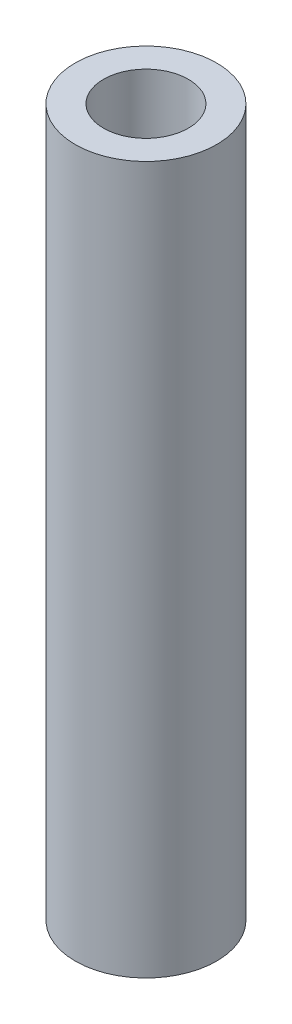
ISO-10303-21;
HEADER;
FILE_DESCRIPTION(('STEP AP214'),'2;1');
FILE_NAME('part.step','',(''),(''),'','','');
FILE_SCHEMA(('AUTOMOTIVE_DESIGN { 1 0 10303 214 1 1 1 1 }'));
ENDSEC;
DATA;
#1=APPLICATION_CONTEXT('core data for automotive mechanical design processes');
#2=APPLICATION_PROTOCOL_DEFINITION('international standard','automotive_design',2000,#1);
#3=PRODUCT_CONTEXT('',#1,'mechanical');
#4=PRODUCT('Part','Part','',(#3));
#5=PRODUCT_RELATED_PRODUCT_CATEGORY('part','',(#4));
#6=PRODUCT_DEFINITION_FORMATION('','',#4);
#7=PRODUCT_DEFINITION_CONTEXT('part definition',#1,'design');
#8=PRODUCT_DEFINITION('design','',#6,#7);
#9=PRODUCT_DEFINITION_SHAPE('','',#8);
#10=(LENGTH_UNIT() NAMED_UNIT(*) SI_UNIT(.MILLI.,.METRE.));
#11=(NAMED_UNIT(*) PLANE_ANGLE_UNIT() SI_UNIT($,.RADIAN.));
#12=(NAMED_UNIT(*) SI_UNIT($,.STERADIAN.) SOLID_ANGLE_UNIT());
#13=UNCERTAINTY_MEASURE_WITH_UNIT(LENGTH_MEASURE(1.E-05),#10,'distance_accuracy_value','');
#14=(GEOMETRIC_REPRESENTATION_CONTEXT(3) GLOBAL_UNCERTAINTY_ASSIGNED_CONTEXT((#13)) GLOBAL_UNIT_ASSIGNED_CONTEXT((#10,
#11,#12)) REPRESENTATION_CONTEXT('',''));
#15=CARTESIAN_POINT('',(0.,0.,0.));
#16=DIRECTION('',(0.,0.,1.));
#17=DIRECTION('',(1.,0.,0.));
#18=AXIS2_PLACEMENT_3D('',#15,#16,#17);
#19=CARTESIAN_POINT('',(0.,50.,0.));
#20=DIRECTION('',(0.,1.,0.));
#21=DIRECTION('',(0.,0.,1.));
#22=AXIS2_PLACEMENT_3D('',#19,#20,#21);
#23=PLANE('',#22);
#24=CARTESIAN_POINT('',(0.,50.,0.));
#25=DIRECTION('',(0.,1.,0.));
#26=DIRECTION('',(0.,0.,1.));
#27=AXIS2_PLACEMENT_3D('',#24,#25,#26);
#28=CIRCLE('',#27,5.);
#29=CARTESIAN_POINT('',(0.,50.,5.));
#30=VERTEX_POINT('',#29);
#31=EDGE_CURVE('E10',#30,#30,#28,.T.);
#32=ORIENTED_EDGE('',*,*,#31,.T.);
#33=EDGE_LOOP('',(#32));
#34=FACE_BOUND('',#33,.T.);
#35=CARTESIAN_POINT('',(0.,50.,0.));
#36=DIRECTION('',(0.,1.,0.));
#37=DIRECTION('',(0.,0.,1.));
#38=AXIS2_PLACEMENT_3D('',#35,#36,#37);
#39=CIRCLE('',#38,3.);
#40=CARTESIAN_POINT('',(0.,50.,3.));
#41=VERTEX_POINT('',#40);
#42=EDGE_CURVE('E53',#41,#41,#39,.T.);
#43=ORIENTED_EDGE('',*,*,#42,.F.);
#44=EDGE_LOOP('',(#43));
#45=FACE_BOUND('',#44,.T.);
#46=ADVANCED_FACE('F40',(#34,#45),#23,.T.);
#47=CARTESIAN_POINT('',(0.,0.,0.));
#48=DIRECTION('',(0.,1.,0.));
#49=DIRECTION('',(0.,0.,1.));
#50=AXIS2_PLACEMENT_3D('',#47,#48,#49);
#51=PLANE('',#50);
#52=CARTESIAN_POINT('',(0.,0.,0.));
#53=DIRECTION('',(0.,1.,0.));
#54=DIRECTION('',(0.,0.,1.));
#55=AXIS2_PLACEMENT_3D('',#52,#53,#54);
#56=CIRCLE('',#55,5.);
#57=CARTESIAN_POINT('',(0.,0.,5.));
#58=VERTEX_POINT('',#57);
#59=EDGE_CURVE('E44',#58,#58,#56,.T.);
#60=ORIENTED_EDGE('',*,*,#59,.F.);
#61=EDGE_LOOP('',(#60));
#62=FACE_BOUND('',#61,.T.);
#63=CARTESIAN_POINT('',(0.,0.,0.));
#64=DIRECTION('',(0.,1.,0.));
#65=DIRECTION('',(0.,0.,1.));
#66=AXIS2_PLACEMENT_3D('',#63,#64,#65);
#67=CIRCLE('',#66,3.);
#68=CARTESIAN_POINT('',(0.,0.,3.));
#69=VERTEX_POINT('',#68);
#70=EDGE_CURVE('E55',#69,#69,#67,.T.);
#71=ORIENTED_EDGE('',*,*,#70,.T.);
#72=EDGE_LOOP('',(#71));
#73=FACE_BOUND('',#72,.T.);
#74=ADVANCED_FACE('F67',(#62,#73),#51,.F.);
#75=CARTESIAN_POINT('',(0.,50.,0.));
#76=DIRECTION('',(0.,-1.,0.));
#77=DIRECTION('',(0.,0.,-1.));
#78=AXIS2_PLACEMENT_3D('',#75,#76,#77);
#79=CYLINDRICAL_SURFACE('',#78,5.);
#80=ORIENTED_EDGE('',*,*,#31,.F.);
#81=EDGE_LOOP('',(#80));
#82=FACE_BOUND('',#81,.T.);
#83=ORIENTED_EDGE('',*,*,#59,.T.);
#84=EDGE_LOOP('',(#83));
#85=FACE_BOUND('',#84,.T.);
#86=ADVANCED_FACE('F42',(#82,#85),#79,.T.);
#87=CARTESIAN_POINT('',(0.,50.,0.));
#88=DIRECTION('',(0.,-1.,0.));
#89=DIRECTION('',(0.,0.,-1.));
#90=AXIS2_PLACEMENT_3D('',#87,#88,#89);
#91=CYLINDRICAL_SURFACE('',#90,3.);
#92=ORIENTED_EDGE('',*,*,#42,.T.);
#93=EDGE_LOOP('',(#92));
#94=FACE_BOUND('',#93,.T.);
#95=ORIENTED_EDGE('',*,*,#70,.F.);
#96=EDGE_LOOP('',(#95));
#97=FACE_BOUND('',#96,.T.);
#98=ADVANCED_FACE('F63',(#94,#97),#91,.F.);
#99=CLOSED_SHELL('',(#46,#74,#86,#98));
#100=MANIFOLD_SOLID_BREP('B2',#99);
#101=ADVANCED_BREP_SHAPE_REPRESENTATION('',(#18,#100),#14);
#102=SHAPE_DEFINITION_REPRESENTATION(#9,#101);
ENDSEC;
END-ISO-10303-21;
